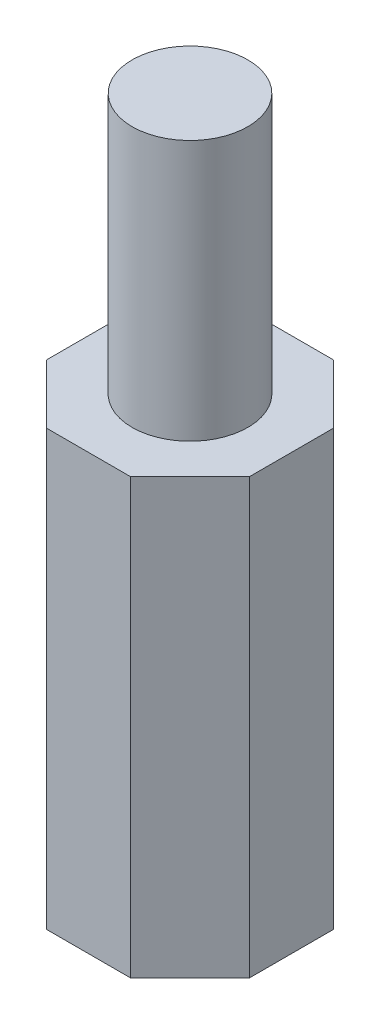
ISO-10303-21;
HEADER;
FILE_DESCRIPTION(('STEP AP214'),'2;1');
FILE_NAME('part.step','',(''),(''),'','','');
FILE_SCHEMA(('AUTOMOTIVE_DESIGN { 1 0 10303 214 1 1 1 1 }'));
ENDSEC;
DATA;
#1=APPLICATION_CONTEXT('core data for automotive mechanical design processes');
#2=APPLICATION_PROTOCOL_DEFINITION('international standard','automotive_design',2000,#1);
#3=PRODUCT_CONTEXT('',#1,'mechanical');
#4=PRODUCT('Part','Part','',(#3));
#5=PRODUCT_RELATED_PRODUCT_CATEGORY('part','',(#4));
#6=PRODUCT_DEFINITION_FORMATION('','',#4);
#7=PRODUCT_DEFINITION_CONTEXT('part definition',#1,'design');
#8=PRODUCT_DEFINITION('design','',#6,#7);
#9=PRODUCT_DEFINITION_SHAPE('','',#8);
#10=(LENGTH_UNIT() NAMED_UNIT(*) SI_UNIT(.MILLI.,.METRE.));
#11=(NAMED_UNIT(*) PLANE_ANGLE_UNIT() SI_UNIT($,.RADIAN.));
#12=(NAMED_UNIT(*) SI_UNIT($,.STERADIAN.) SOLID_ANGLE_UNIT());
#13=UNCERTAINTY_MEASURE_WITH_UNIT(LENGTH_MEASURE(1.E-05),#10,'distance_accuracy_value','');
#14=(GEOMETRIC_REPRESENTATION_CONTEXT(3) GLOBAL_UNCERTAINTY_ASSIGNED_CONTEXT((#13)) GLOBAL_UNIT_ASSIGNED_CONTEXT((#10,
#11,#12)) REPRESENTATION_CONTEXT('',''));
#15=CARTESIAN_POINT('',(0.,0.,0.));
#16=DIRECTION('',(0.,0.,1.));
#17=DIRECTION('',(1.,0.,0.));
#18=AXIS2_PLACEMENT_3D('',#15,#16,#17);
#19=CARTESIAN_POINT('',(-4.94974746830584,7.5,0.));
#20=DIRECTION('',(0.,1.,0.));
#21=DIRECTION('',(0.,0.,1.));
#22=AXIS2_PLACEMENT_3D('',#19,#20,#21);
#23=PLANE('',#22);
#24=DIRECTION('',(-0.707106781186548,0.,0.707106781186546));
#25=VECTOR('',#24,1.);
#26=CARTESIAN_POINT('',(-3.5,7.5,-1.44974746830583));
#27=LINE('',#26,#25);
#28=CARTESIAN_POINT('',(-1.44974746830583,7.5,-3.5));
#29=VERTEX_POINT('',#28);
#30=CARTESIAN_POINT('',(-3.5,7.5,-1.44974746830583));
#31=VERTEX_POINT('',#30);
#32=EDGE_CURVE('E144',#29,#31,#27,.T.);
#33=ORIENTED_EDGE('',*,*,#32,.T.);
#34=DIRECTION('',(0.,0.,1.));
#35=VECTOR('',#34,1.);
#36=CARTESIAN_POINT('',(-3.5,7.5,1.44974746830583));
#37=LINE('',#36,#35);
#38=CARTESIAN_POINT('',(-3.5,7.5,1.44974746830583));
#39=VERTEX_POINT('',#38);
#40=EDGE_CURVE('E92',#31,#39,#37,.T.);
#41=ORIENTED_EDGE('',*,*,#40,.T.);
#42=DIRECTION('',(0.707106781186548,0.,0.707106781186548));
#43=VECTOR('',#42,1.);
#44=CARTESIAN_POINT('',(-1.44974746830583,7.5,3.5));
#45=LINE('',#44,#43);
#46=CARTESIAN_POINT('',(-1.44974746830583,7.5,3.5));
#47=VERTEX_POINT('',#46);
#48=EDGE_CURVE('E159',#39,#47,#45,.T.);
#49=ORIENTED_EDGE('',*,*,#48,.T.);
#50=DIRECTION('',(1.,0.,0.));
#51=VECTOR('',#50,1.);
#52=CARTESIAN_POINT('',(1.44974746830583,7.5,3.5));
#53=LINE('',#52,#51);
#54=CARTESIAN_POINT('',(1.44974746830583,7.5,3.5));
#55=VERTEX_POINT('',#54);
#56=EDGE_CURVE('E171',#47,#55,#53,.T.);
#57=ORIENTED_EDGE('',*,*,#56,.T.);
#58=DIRECTION('',(0.707106781186548,0.,-0.707106781186547));
#59=VECTOR('',#58,1.);
#60=CARTESIAN_POINT('',(3.5,7.5,1.44974746830583));
#61=LINE('',#60,#59);
#62=CARTESIAN_POINT('',(3.5,7.5,1.44974746830583));
#63=VERTEX_POINT('',#62);
#64=EDGE_CURVE('E111',#55,#63,#61,.T.);
#65=ORIENTED_EDGE('',*,*,#64,.T.);
#66=DIRECTION('',(0.,0.,-1.));
#67=VECTOR('',#66,1.);
#68=CARTESIAN_POINT('',(3.5,7.5,-1.44974746830583));
#69=LINE('',#68,#67);
#70=CARTESIAN_POINT('',(3.5,7.5,-1.44974746830583));
#71=VERTEX_POINT('',#70);
#72=EDGE_CURVE('E105',#63,#71,#69,.T.);
#73=ORIENTED_EDGE('',*,*,#72,.T.);
#74=DIRECTION('',(-0.707106781186548,0.,-0.707106781186547));
#75=VECTOR('',#74,1.);
#76=CARTESIAN_POINT('',(1.44974746830583,7.5,-3.5));
#77=LINE('',#76,#75);
#78=CARTESIAN_POINT('',(1.44974746830583,7.5,-3.5));
#79=VERTEX_POINT('',#78);
#80=EDGE_CURVE('E109',#71,#79,#77,.T.);
#81=ORIENTED_EDGE('',*,*,#80,.T.);
#82=DIRECTION('',(-1.,0.,0.));
#83=VECTOR('',#82,1.);
#84=CARTESIAN_POINT('',(-1.44974746830583,7.5,-3.5));
#85=LINE('',#84,#83);
#86=EDGE_CURVE('E49',#79,#29,#85,.T.);
#87=ORIENTED_EDGE('',*,*,#86,.T.);
#88=EDGE_LOOP('',(#33,#41,#49,#57,#65,#73,#81,#87));
#89=FACE_BOUND('',#88,.T.);
#90=CARTESIAN_POINT('',(0.,7.5,0.));
#91=DIRECTION('',(0.,1.,0.));
#92=DIRECTION('',(0.,0.,1.));
#93=AXIS2_PLACEMENT_3D('',#90,#91,#92);
#94=CIRCLE('',#93,2.);
#95=CARTESIAN_POINT('',(0.,7.5,2.));
#96=VERTEX_POINT('',#95);
#97=EDGE_CURVE('E177',#96,#96,#94,.T.);
#98=ORIENTED_EDGE('',*,*,#97,.F.);
#99=EDGE_LOOP('',(#98));
#100=FACE_BOUND('',#99,.T.);
#101=ADVANCED_FACE('F32',(#89,#100),#23,.T.);
#102=CARTESIAN_POINT('',(-3.5,7.5,-1.44974746830583));
#103=DIRECTION('',(0.707106781186546,0.,0.707106781186549));
#104=DIRECTION('',(0.707106781186549,0.,-0.707106781186546));
#105=AXIS2_PLACEMENT_3D('',#102,#103,#104);
#106=PLANE('',#105);
#107=DIRECTION('',(-0.707106781186548,0.,0.707106781186546));
#108=VECTOR('',#107,1.);
#109=CARTESIAN_POINT('',(-3.5,-7.5,-1.44974746830583));
#110=LINE('',#109,#108);
#111=CARTESIAN_POINT('',(-1.44974746830583,-7.5,-3.5));
#112=VERTEX_POINT('',#111);
#113=CARTESIAN_POINT('',(-3.5,-7.5,-1.44974746830583));
#114=VERTEX_POINT('',#113);
#115=EDGE_CURVE('E129',#112,#114,#110,.T.);
#116=ORIENTED_EDGE('',*,*,#115,.T.);
#117=DIRECTION('',(0.,-1.,0.));
#118=VECTOR('',#117,1.);
#119=CARTESIAN_POINT('',(-3.5,7.5,-1.44974746830583));
#120=LINE('',#119,#118);
#121=EDGE_CURVE('E11',#31,#114,#120,.T.);
#122=ORIENTED_EDGE('',*,*,#121,.F.);
#123=ORIENTED_EDGE('',*,*,#32,.F.);
#124=DIRECTION('',(0.,-1.,0.));
#125=VECTOR('',#124,1.);
#126=CARTESIAN_POINT('',(-1.44974746830583,7.5,-3.5));
#127=LINE('',#126,#125);
#128=EDGE_CURVE('E125',#29,#112,#127,.T.);
#129=ORIENTED_EDGE('',*,*,#128,.T.);
#130=EDGE_LOOP('',(#116,#122,#123,#129));
#131=FACE_BOUND('',#130,.T.);
#132=ADVANCED_FACE('F34',(#131),#106,.F.);
#133=CARTESIAN_POINT('',(-3.5,7.5,1.44974746830583));
#134=DIRECTION('',(1.,0.,0.));
#135=DIRECTION('',(0.,0.,-1.));
#136=AXIS2_PLACEMENT_3D('',#133,#134,#135);
#137=PLANE('',#136);
#138=DIRECTION('',(0.,0.,1.));
#139=VECTOR('',#138,1.);
#140=CARTESIAN_POINT('',(-3.5,-7.5,1.44974746830583));
#141=LINE('',#140,#139);
#142=CARTESIAN_POINT('',(-3.5,-7.5,1.44974746830583));
#143=VERTEX_POINT('',#142);
#144=EDGE_CURVE('E132',#114,#143,#141,.T.);
#145=ORIENTED_EDGE('',*,*,#144,.T.);
#146=DIRECTION('',(0.,-1.,0.));
#147=VECTOR('',#146,1.);
#148=CARTESIAN_POINT('',(-3.5,7.5,1.44974746830583));
#149=LINE('',#148,#147);
#150=EDGE_CURVE('E41',#39,#143,#149,.T.);
#151=ORIENTED_EDGE('',*,*,#150,.F.);
#152=ORIENTED_EDGE('',*,*,#40,.F.);
#153=ORIENTED_EDGE('',*,*,#121,.T.);
#154=EDGE_LOOP('',(#145,#151,#152,#153));
#155=FACE_BOUND('',#154,.T.);
#156=ADVANCED_FACE('F214',(#155),#137,.F.);
#157=CARTESIAN_POINT('',(-1.44974746830583,7.5,3.5));
#158=DIRECTION('',(0.707106781186547,0.,-0.707106781186547));
#159=DIRECTION('',(-0.707106781186548,0.,-0.707106781186548));
#160=AXIS2_PLACEMENT_3D('',#157,#158,#159);
#161=PLANE('',#160);
#162=DIRECTION('',(0.707106781186548,0.,0.707106781186548));
#163=VECTOR('',#162,1.);
#164=CARTESIAN_POINT('',(-1.44974746830583,-7.5,3.5));
#165=LINE('',#164,#163);
#166=CARTESIAN_POINT('',(-1.44974746830583,-7.5,3.5));
#167=VERTEX_POINT('',#166);
#168=EDGE_CURVE('E135',#143,#167,#165,.T.);
#169=ORIENTED_EDGE('',*,*,#168,.T.);
#170=DIRECTION('',(0.,-1.,0.));
#171=VECTOR('',#170,1.);
#172=CARTESIAN_POINT('',(-1.44974746830583,7.5,3.5));
#173=LINE('',#172,#171);
#174=EDGE_CURVE('E151',#47,#167,#173,.T.);
#175=ORIENTED_EDGE('',*,*,#174,.F.);
#176=ORIENTED_EDGE('',*,*,#48,.F.);
#177=ORIENTED_EDGE('',*,*,#150,.T.);
#178=EDGE_LOOP('',(#169,#175,#176,#177));
#179=FACE_BOUND('',#178,.T.);
#180=ADVANCED_FACE('F157',(#179),#161,.F.);
#181=CARTESIAN_POINT('',(1.44974746830583,7.5,3.5));
#182=DIRECTION('',(0.,0.,-1.));
#183=DIRECTION('',(-1.,0.,0.));
#184=AXIS2_PLACEMENT_3D('',#181,#182,#183);
#185=PLANE('',#184);
#186=DIRECTION('',(1.,0.,0.));
#187=VECTOR('',#186,1.);
#188=CARTESIAN_POINT('',(1.44974746830583,-7.5,3.5));
#189=LINE('',#188,#187);
#190=CARTESIAN_POINT('',(1.44974746830583,-7.5,3.5));
#191=VERTEX_POINT('',#190);
#192=EDGE_CURVE('E137',#167,#191,#189,.T.);
#193=ORIENTED_EDGE('',*,*,#192,.T.);
#194=DIRECTION('',(0.,-1.,0.));
#195=VECTOR('',#194,1.);
#196=CARTESIAN_POINT('',(1.44974746830583,7.5,3.5));
#197=LINE('',#196,#195);
#198=EDGE_CURVE('E148',#55,#191,#197,.T.);
#199=ORIENTED_EDGE('',*,*,#198,.F.);
#200=ORIENTED_EDGE('',*,*,#56,.F.);
#201=ORIENTED_EDGE('',*,*,#174,.T.);
#202=EDGE_LOOP('',(#193,#199,#200,#201));
#203=FACE_BOUND('',#202,.T.);
#204=ADVANCED_FACE('F167',(#203),#185,.F.);
#205=CARTESIAN_POINT('',(3.5,7.5,1.44974746830583));
#206=DIRECTION('',(-0.707106781186547,0.,-0.707106781186548));
#207=DIRECTION('',(-0.707106781186548,0.,0.707106781186547));
#208=AXIS2_PLACEMENT_3D('',#205,#206,#207);
#209=PLANE('',#208);
#210=DIRECTION('',(0.707106781186548,0.,-0.707106781186547));
#211=VECTOR('',#210,1.);
#212=CARTESIAN_POINT('',(3.5,-7.5,1.44974746830583));
#213=LINE('',#212,#211);
#214=CARTESIAN_POINT('',(3.5,-7.5,1.44974746830583));
#215=VERTEX_POINT('',#214);
#216=EDGE_CURVE('E139',#191,#215,#213,.T.);
#217=ORIENTED_EDGE('',*,*,#216,.T.);
#218=DIRECTION('',(0.,-1.,0.));
#219=VECTOR('',#218,1.);
#220=CARTESIAN_POINT('',(3.5,7.5,1.44974746830583));
#221=LINE('',#220,#219);
#222=EDGE_CURVE('E120',#63,#215,#221,.T.);
#223=ORIENTED_EDGE('',*,*,#222,.F.);
#224=ORIENTED_EDGE('',*,*,#64,.F.);
#225=ORIENTED_EDGE('',*,*,#198,.T.);
#226=EDGE_LOOP('',(#217,#223,#224,#225));
#227=FACE_BOUND('',#226,.T.);
#228=ADVANCED_FACE('F170',(#227),#209,.F.);
#229=CARTESIAN_POINT('',(3.5,7.5,-1.44974746830583));
#230=DIRECTION('',(-1.,0.,0.));
#231=DIRECTION('',(0.,0.,1.));
#232=AXIS2_PLACEMENT_3D('',#229,#230,#231);
#233=PLANE('',#232);
#234=DIRECTION('',(0.,0.,-1.));
#235=VECTOR('',#234,1.);
#236=CARTESIAN_POINT('',(3.5,-7.5,-1.44974746830583));
#237=LINE('',#236,#235);
#238=CARTESIAN_POINT('',(3.5,-7.5,-1.44974746830583));
#239=VERTEX_POINT('',#238);
#240=EDGE_CURVE('E119',#215,#239,#237,.T.);
#241=ORIENTED_EDGE('',*,*,#240,.T.);
#242=DIRECTION('',(0.,-1.,0.));
#243=VECTOR('',#242,1.);
#244=CARTESIAN_POINT('',(3.5,7.5,-1.44974746830583));
#245=LINE('',#244,#243);
#246=EDGE_CURVE('E116',#71,#239,#245,.T.);
#247=ORIENTED_EDGE('',*,*,#246,.F.);
#248=ORIENTED_EDGE('',*,*,#72,.F.);
#249=ORIENTED_EDGE('',*,*,#222,.T.);
#250=EDGE_LOOP('',(#241,#247,#248,#249));
#251=FACE_BOUND('',#250,.T.);
#252=ADVANCED_FACE('F117',(#251),#233,.F.);
#253=CARTESIAN_POINT('',(1.44974746830583,7.5,-3.5));
#254=DIRECTION('',(-0.707106781186547,0.,0.707106781186548));
#255=DIRECTION('',(0.707106781186548,0.,0.707106781186547));
#256=AXIS2_PLACEMENT_3D('',#253,#254,#255);
#257=PLANE('',#256);
#258=DIRECTION('',(-0.707106781186548,0.,-0.707106781186547));
#259=VECTOR('',#258,1.);
#260=CARTESIAN_POINT('',(1.44974746830583,-7.5,-3.5));
#261=LINE('',#260,#259);
#262=CARTESIAN_POINT('',(1.44974746830583,-7.5,-3.5));
#263=VERTEX_POINT('',#262);
#264=EDGE_CURVE('E78',#239,#263,#261,.T.);
#265=ORIENTED_EDGE('',*,*,#264,.T.);
#266=DIRECTION('',(0.,-1.,0.));
#267=VECTOR('',#266,1.);
#268=CARTESIAN_POINT('',(1.44974746830583,7.5,-3.5));
#269=LINE('',#268,#267);
#270=EDGE_CURVE('E121',#79,#263,#269,.T.);
#271=ORIENTED_EDGE('',*,*,#270,.F.);
#272=ORIENTED_EDGE('',*,*,#80,.F.);
#273=ORIENTED_EDGE('',*,*,#246,.T.);
#274=EDGE_LOOP('',(#265,#271,#272,#273));
#275=FACE_BOUND('',#274,.T.);
#276=ADVANCED_FACE('F123',(#275),#257,.F.);
#277=CARTESIAN_POINT('',(-1.44974746830583,7.5,-3.5));
#278=DIRECTION('',(0.,0.,1.));
#279=DIRECTION('',(1.,0.,0.));
#280=AXIS2_PLACEMENT_3D('',#277,#278,#279);
#281=PLANE('',#280);
#282=DIRECTION('',(-1.,0.,0.));
#283=VECTOR('',#282,1.);
#284=CARTESIAN_POINT('',(-1.44974746830583,-7.5,-3.5));
#285=LINE('',#284,#283);
#286=EDGE_CURVE('E84',#263,#112,#285,.T.);
#287=ORIENTED_EDGE('',*,*,#286,.T.);
#288=ORIENTED_EDGE('',*,*,#128,.F.);
#289=ORIENTED_EDGE('',*,*,#86,.F.);
#290=ORIENTED_EDGE('',*,*,#270,.T.);
#291=EDGE_LOOP('',(#287,#288,#289,#290));
#292=FACE_BOUND('',#291,.T.);
#293=ADVANCED_FACE('F200',(#292),#281,.F.);
#294=CARTESIAN_POINT('',(-4.94974746830584,-7.5,0.));
#295=DIRECTION('',(0.,1.,0.));
#296=DIRECTION('',(0.,0.,1.));
#297=AXIS2_PLACEMENT_3D('',#294,#295,#296);
#298=PLANE('',#297);
#299=CARTESIAN_POINT('',(0.,-7.5,0.));
#300=DIRECTION('',(0.,-1.,0.));
#301=DIRECTION('',(0.,0.,-1.));
#302=AXIS2_PLACEMENT_3D('',#299,#300,#301);
#303=CIRCLE('',#302,2.);
#304=CARTESIAN_POINT('',(0.,-7.5,-2.));
#305=VERTEX_POINT('',#304);
#306=EDGE_CURVE('E183',#305,#305,#303,.T.);
#307=ORIENTED_EDGE('',*,*,#306,.F.);
#308=EDGE_LOOP('',(#307));
#309=FACE_BOUND('',#308,.T.);
#310=ORIENTED_EDGE('',*,*,#115,.F.);
#311=ORIENTED_EDGE('',*,*,#286,.F.);
#312=ORIENTED_EDGE('',*,*,#264,.F.);
#313=ORIENTED_EDGE('',*,*,#240,.F.);
#314=ORIENTED_EDGE('',*,*,#216,.F.);
#315=ORIENTED_EDGE('',*,*,#192,.F.);
#316=ORIENTED_EDGE('',*,*,#168,.F.);
#317=ORIENTED_EDGE('',*,*,#144,.F.);
#318=EDGE_LOOP('',(#310,#311,#312,#313,#314,#315,#316,#317));
#319=FACE_BOUND('',#318,.T.);
#320=ADVANCED_FACE('F163',(#309,#319),#298,.F.);
#321=CARTESIAN_POINT('',(0.,16.5,0.));
#322=DIRECTION('',(0.,-1.,0.));
#323=DIRECTION('',(0.,0.,-1.));
#324=AXIS2_PLACEMENT_3D('',#321,#322,#323);
#325=CYLINDRICAL_SURFACE('',#324,2.);
#326=CARTESIAN_POINT('',(0.,16.5,0.));
#327=DIRECTION('',(0.,1.,0.));
#328=DIRECTION('',(0.,0.,1.));
#329=AXIS2_PLACEMENT_3D('',#326,#327,#328);
#330=CIRCLE('',#329,2.);
#331=CARTESIAN_POINT('',(0.,16.5,2.));
#332=VERTEX_POINT('',#331);
#333=EDGE_CURVE('E133',#332,#332,#330,.T.);
#334=ORIENTED_EDGE('',*,*,#333,.F.);
#335=EDGE_LOOP('',(#334));
#336=FACE_BOUND('',#335,.T.);
#337=ORIENTED_EDGE('',*,*,#97,.T.);
#338=EDGE_LOOP('',(#337));
#339=FACE_BOUND('',#338,.T.);
#340=ADVANCED_FACE('F199',(#336,#339),#325,.T.);
#341=CARTESIAN_POINT('',(0.,16.5,0.));
#342=DIRECTION('',(0.,1.,0.));
#343=DIRECTION('',(0.,0.,1.));
#344=AXIS2_PLACEMENT_3D('',#341,#342,#343);
#345=PLANE('',#344);
#346=ORIENTED_EDGE('',*,*,#333,.T.);
#347=EDGE_LOOP('',(#346));
#348=FACE_BOUND('',#347,.T.);
#349=ADVANCED_FACE('F194',(#348),#345,.T.);
#350=CARTESIAN_POINT('',(0.,1.5,0.));
#351=DIRECTION('',(0.,-1.,0.));
#352=DIRECTION('',(0.,0.,-1.));
#353=AXIS2_PLACEMENT_3D('',#350,#351,#352);
#354=CYLINDRICAL_SURFACE('',#353,2.);
#355=CARTESIAN_POINT('',(0.,1.5,0.));
#356=DIRECTION('',(0.,-1.,0.));
#357=DIRECTION('',(0.,0.,-1.));
#358=AXIS2_PLACEMENT_3D('',#355,#356,#357);
#359=CIRCLE('',#358,2.);
#360=CARTESIAN_POINT('',(0.,1.5,-2.));
#361=VERTEX_POINT('',#360);
#362=EDGE_CURVE('E180',#361,#361,#359,.T.);
#363=ORIENTED_EDGE('',*,*,#362,.F.);
#364=EDGE_LOOP('',(#363));
#365=FACE_BOUND('',#364,.T.);
#366=ORIENTED_EDGE('',*,*,#306,.T.);
#367=EDGE_LOOP('',(#366));
#368=FACE_BOUND('',#367,.T.);
#369=ADVANCED_FACE('F191',(#365,#368),#354,.F.);
#370=CARTESIAN_POINT('',(0.,1.5,0.));
#371=DIRECTION('',(0.,-1.,0.));
#372=DIRECTION('',(0.,0.,-1.));
#373=AXIS2_PLACEMENT_3D('',#370,#371,#372);
#374=PLANE('',#373);
#375=ORIENTED_EDGE('',*,*,#362,.T.);
#376=EDGE_LOOP('',(#375));
#377=FACE_BOUND('',#376,.T.);
#378=ADVANCED_FACE('F189',(#377),#374,.T.);
#379=CLOSED_SHELL('',(#101,#132,#156,#180,#204,#228,#252,#276,#293,#320,#340,#349,#369,#378));
#380=MANIFOLD_SOLID_BREP('B2',#379);
#381=ADVANCED_BREP_SHAPE_REPRESENTATION('',(#18,#380),#14);
#382=SHAPE_DEFINITION_REPRESENTATION(#9,#381);
ENDSEC;
END-ISO-10303-21;
